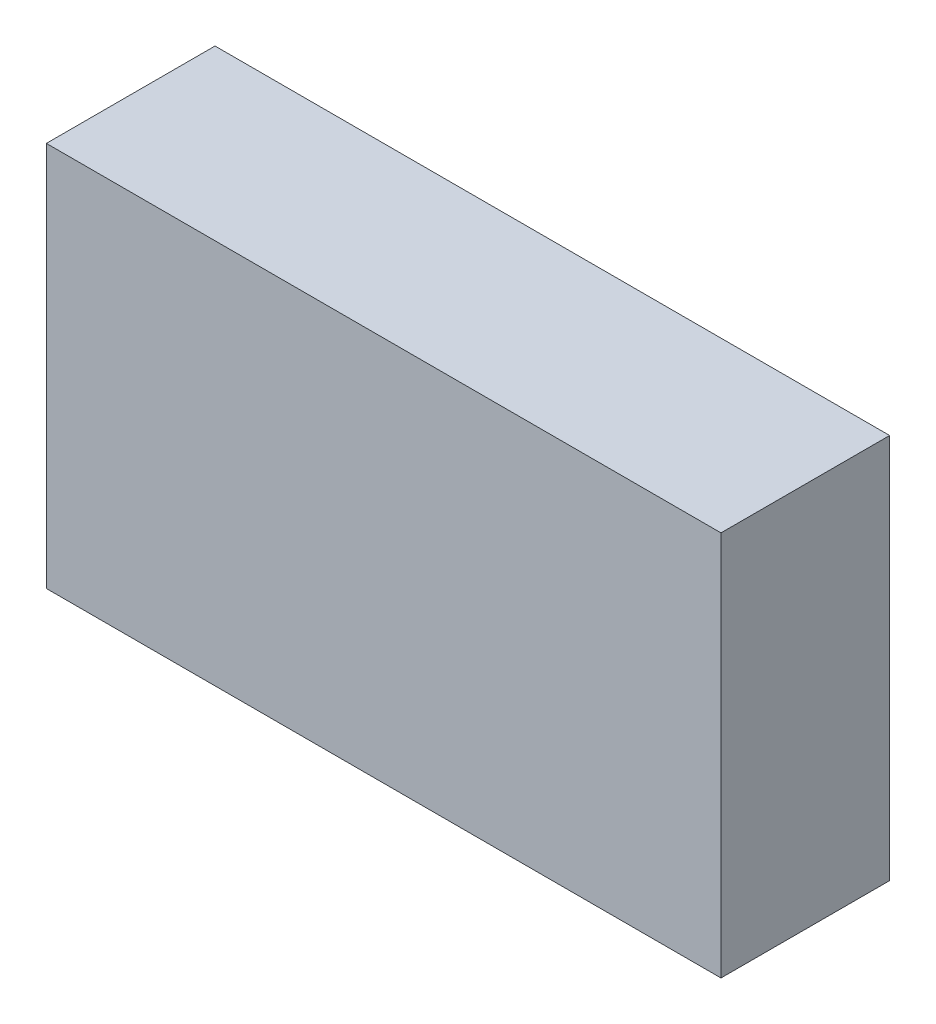
ISO-10303-21;
HEADER;
FILE_DESCRIPTION(('STEP AP214'),'2;1');
FILE_NAME('part.step','',(''),(''),'','','');
FILE_SCHEMA(('AUTOMOTIVE_DESIGN { 1 0 10303 214 1 1 1 1 }'));
ENDSEC;
DATA;
#1=APPLICATION_CONTEXT('core data for automotive mechanical design processes');
#2=APPLICATION_PROTOCOL_DEFINITION('international standard','automotive_design',2000,#1);
#3=PRODUCT_CONTEXT('',#1,'mechanical');
#4=PRODUCT('Part','Part','',(#3));
#5=PRODUCT_RELATED_PRODUCT_CATEGORY('part','',(#4));
#6=PRODUCT_DEFINITION_FORMATION('','',#4);
#7=PRODUCT_DEFINITION_CONTEXT('part definition',#1,'design');
#8=PRODUCT_DEFINITION('design','',#6,#7);
#9=PRODUCT_DEFINITION_SHAPE('','',#8);
#10=(LENGTH_UNIT() NAMED_UNIT(*) SI_UNIT(.MILLI.,.METRE.));
#11=(NAMED_UNIT(*) PLANE_ANGLE_UNIT() SI_UNIT($,.RADIAN.));
#12=(NAMED_UNIT(*) SI_UNIT($,.STERADIAN.) SOLID_ANGLE_UNIT());
#13=UNCERTAINTY_MEASURE_WITH_UNIT(LENGTH_MEASURE(1.E-05),#10,'distance_accuracy_value','');
#14=(GEOMETRIC_REPRESENTATION_CONTEXT(3) GLOBAL_UNCERTAINTY_ASSIGNED_CONTEXT((#13)) GLOBAL_UNIT_ASSIGNED_CONTEXT((#10,
#11,#12)) REPRESENTATION_CONTEXT('',''));
#15=CARTESIAN_POINT('',(0.,0.,0.));
#16=DIRECTION('',(0.,0.,1.));
#17=DIRECTION('',(1.,0.,0.));
#18=AXIS2_PLACEMENT_3D('',#15,#16,#17);
#19=CARTESIAN_POINT('',(-88.9,-101.6,44.45));
#20=DIRECTION('',(-1.,0.,0.));
#21=DIRECTION('',(0.,0.,1.));
#22=AXIS2_PLACEMENT_3D('',#19,#20,#21);
#23=PLANE('',#22);
#24=DIRECTION('',(0.,0.,1.));
#25=VECTOR('',#24,1.);
#26=CARTESIAN_POINT('',(-88.9,0.,44.45));
#27=LINE('',#26,#25);
#28=CARTESIAN_POINT('',(-88.9,0.,0.));
#29=VERTEX_POINT('',#28);
#30=CARTESIAN_POINT('',(-88.9,0.,44.45));
#31=VERTEX_POINT('',#30);
#32=EDGE_CURVE('E96',#29,#31,#27,.T.);
#33=ORIENTED_EDGE('',*,*,#32,.F.);
#34=DIRECTION('',(0.,1.,0.));
#35=VECTOR('',#34,1.);
#36=CARTESIAN_POINT('',(-88.9,-101.6,0.));
#37=LINE('',#36,#35);
#38=CARTESIAN_POINT('',(-88.9,-101.6,0.));
#39=VERTEX_POINT('',#38);
#40=EDGE_CURVE('E11',#39,#29,#37,.T.);
#41=ORIENTED_EDGE('',*,*,#40,.F.);
#42=DIRECTION('',(0.,0.,1.));
#43=VECTOR('',#42,1.);
#44=CARTESIAN_POINT('',(-88.9,-101.6,44.45));
#45=LINE('',#44,#43);
#46=CARTESIAN_POINT('',(-88.9,-101.6,44.45));
#47=VERTEX_POINT('',#46);
#48=EDGE_CURVE('E90',#39,#47,#45,.T.);
#49=ORIENTED_EDGE('',*,*,#48,.T.);
#50=DIRECTION('',(0.,1.,0.));
#51=VECTOR('',#50,1.);
#52=CARTESIAN_POINT('',(-88.9,-101.6,44.45));
#53=LINE('',#52,#51);
#54=EDGE_CURVE('E35',#47,#31,#53,.T.);
#55=ORIENTED_EDGE('',*,*,#54,.T.);
#56=EDGE_LOOP('',(#33,#41,#49,#55));
#57=FACE_BOUND('',#56,.T.);
#58=ADVANCED_FACE('F32',(#57),#23,.T.);
#59=CARTESIAN_POINT('',(-88.9,-101.6,0.));
#60=DIRECTION('',(0.,0.,-1.));
#61=DIRECTION('',(-1.,0.,0.));
#62=AXIS2_PLACEMENT_3D('',#59,#60,#61);
#63=PLANE('',#62);
#64=DIRECTION('',(-1.,0.,0.));
#65=VECTOR('',#64,1.);
#66=CARTESIAN_POINT('',(-88.9,0.,0.));
#67=LINE('',#66,#65);
#68=CARTESIAN_POINT('',(88.9,0.,0.));
#69=VERTEX_POINT('',#68);
#70=EDGE_CURVE('E92',#69,#29,#67,.T.);
#71=ORIENTED_EDGE('',*,*,#70,.F.);
#72=DIRECTION('',(0.,1.,0.));
#73=VECTOR('',#72,1.);
#74=CARTESIAN_POINT('',(88.9,-101.6,0.));
#75=LINE('',#74,#73);
#76=CARTESIAN_POINT('',(88.9,-101.6,0.));
#77=VERTEX_POINT('',#76);
#78=EDGE_CURVE('E41',#77,#69,#75,.T.);
#79=ORIENTED_EDGE('',*,*,#78,.F.);
#80=DIRECTION('',(-1.,0.,0.));
#81=VECTOR('',#80,1.);
#82=CARTESIAN_POINT('',(-88.9,-101.6,0.));
#83=LINE('',#82,#81);
#84=EDGE_CURVE('E87',#77,#39,#83,.T.);
#85=ORIENTED_EDGE('',*,*,#84,.T.);
#86=ORIENTED_EDGE('',*,*,#40,.T.);
#87=EDGE_LOOP('',(#71,#79,#85,#86));
#88=FACE_BOUND('',#87,.T.);
#89=ADVANCED_FACE('F106',(#88),#63,.T.);
#90=CARTESIAN_POINT('',(88.9,-101.6,0.));
#91=DIRECTION('',(1.,0.,0.));
#92=DIRECTION('',(0.,0.,-1.));
#93=AXIS2_PLACEMENT_3D('',#90,#91,#92);
#94=PLANE('',#93);
#95=DIRECTION('',(0.,0.,-1.));
#96=VECTOR('',#95,1.);
#97=CARTESIAN_POINT('',(88.9,0.,0.));
#98=LINE('',#97,#96);
#99=CARTESIAN_POINT('',(88.9,0.,44.45));
#100=VERTEX_POINT('',#99);
#101=EDGE_CURVE('E82',#100,#69,#98,.T.);
#102=ORIENTED_EDGE('',*,*,#101,.F.);
#103=DIRECTION('',(0.,1.,0.));
#104=VECTOR('',#103,1.);
#105=CARTESIAN_POINT('',(88.9,-101.6,44.45));
#106=LINE('',#105,#104);
#107=CARTESIAN_POINT('',(88.9,-101.6,44.45));
#108=VERTEX_POINT('',#107);
#109=EDGE_CURVE('E77',#108,#100,#106,.T.);
#110=ORIENTED_EDGE('',*,*,#109,.F.);
#111=DIRECTION('',(0.,0.,-1.));
#112=VECTOR('',#111,1.);
#113=CARTESIAN_POINT('',(88.9,-101.6,0.));
#114=LINE('',#113,#112);
#115=EDGE_CURVE('E80',#108,#77,#114,.T.);
#116=ORIENTED_EDGE('',*,*,#115,.T.);
#117=ORIENTED_EDGE('',*,*,#78,.T.);
#118=EDGE_LOOP('',(#102,#110,#116,#117));
#119=FACE_BOUND('',#118,.T.);
#120=ADVANCED_FACE('F79',(#119),#94,.T.);
#121=CARTESIAN_POINT('',(88.9,-101.6,44.45));
#122=DIRECTION('',(0.,0.,1.));
#123=DIRECTION('',(1.,0.,0.));
#124=AXIS2_PLACEMENT_3D('',#121,#122,#123);
#125=PLANE('',#124);
#126=DIRECTION('',(1.,0.,0.));
#127=VECTOR('',#126,1.);
#128=CARTESIAN_POINT('',(88.9,0.,44.45));
#129=LINE('',#128,#127);
#130=EDGE_CURVE('E99',#31,#100,#129,.T.);
#131=ORIENTED_EDGE('',*,*,#130,.F.);
#132=ORIENTED_EDGE('',*,*,#54,.F.);
#133=DIRECTION('',(1.,0.,0.));
#134=VECTOR('',#133,1.);
#135=CARTESIAN_POINT('',(88.9,-101.6,44.45));
#136=LINE('',#135,#134);
#137=EDGE_CURVE('E86',#47,#108,#136,.T.);
#138=ORIENTED_EDGE('',*,*,#137,.T.);
#139=ORIENTED_EDGE('',*,*,#109,.T.);
#140=EDGE_LOOP('',(#131,#132,#138,#139));
#141=FACE_BOUND('',#140,.T.);
#142=ADVANCED_FACE('F89',(#141),#125,.T.);
#143=CARTESIAN_POINT('',(0.,-101.6,0.));
#144=DIRECTION('',(0.,-1.,0.));
#145=DIRECTION('',(0.,0.,-1.));
#146=AXIS2_PLACEMENT_3D('',#143,#144,#145);
#147=PLANE('',#146);
#148=ORIENTED_EDGE('',*,*,#48,.F.);
#149=ORIENTED_EDGE('',*,*,#84,.F.);
#150=ORIENTED_EDGE('',*,*,#115,.F.);
#151=ORIENTED_EDGE('',*,*,#137,.F.);
#152=EDGE_LOOP('',(#148,#149,#150,#151));
#153=FACE_BOUND('',#152,.T.);
#154=ADVANCED_FACE('F85',(#153),#147,.T.);
#155=CARTESIAN_POINT('',(0.,0.,0.));
#156=DIRECTION('',(0.,-1.,0.));
#157=DIRECTION('',(0.,0.,-1.));
#158=AXIS2_PLACEMENT_3D('',#155,#156,#157);
#159=PLANE('',#158);
#160=ORIENTED_EDGE('',*,*,#32,.T.);
#161=ORIENTED_EDGE('',*,*,#130,.T.);
#162=ORIENTED_EDGE('',*,*,#101,.T.);
#163=ORIENTED_EDGE('',*,*,#70,.T.);
#164=EDGE_LOOP('',(#160,#161,#162,#163));
#165=FACE_BOUND('',#164,.T.);
#166=ADVANCED_FACE('F105',(#165),#159,.F.);
#167=CLOSED_SHELL('',(#58,#89,#120,#142,#154,#166));
#168=MANIFOLD_SOLID_BREP('B2',#167);
#169=ADVANCED_BREP_SHAPE_REPRESENTATION('',(#18,#168),#14);
#170=SHAPE_DEFINITION_REPRESENTATION(#9,#169);
ENDSEC;
END-ISO-10303-21;
